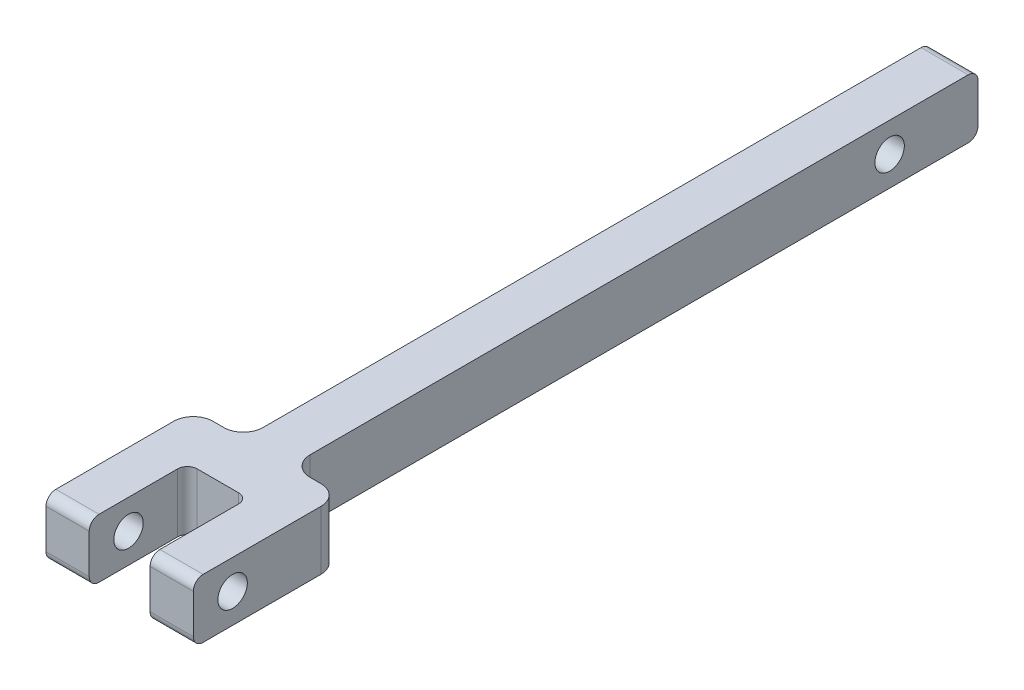
ISO-10303-21;
HEADER;
FILE_DESCRIPTION(('STEP AP214'),'2;1');
FILE_NAME('part.step','',(''),(''),'','','');
FILE_SCHEMA(('AUTOMOTIVE_DESIGN { 1 0 10303 214 1 1 1 1 }'));
ENDSEC;
DATA;
#1=APPLICATION_CONTEXT('core data for automotive mechanical design processes');
#2=APPLICATION_PROTOCOL_DEFINITION('international standard','automotive_design',2000,#1);
#3=PRODUCT_CONTEXT('',#1,'mechanical');
#4=PRODUCT('Part','Part','',(#3));
#5=PRODUCT_RELATED_PRODUCT_CATEGORY('part','',(#4));
#6=PRODUCT_DEFINITION_FORMATION('','',#4);
#7=PRODUCT_DEFINITION_CONTEXT('part definition',#1,'design');
#8=PRODUCT_DEFINITION('design','',#6,#7);
#9=PRODUCT_DEFINITION_SHAPE('','',#8);
#10=(LENGTH_UNIT() NAMED_UNIT(*) SI_UNIT(.MILLI.,.METRE.));
#11=(NAMED_UNIT(*) PLANE_ANGLE_UNIT() SI_UNIT($,.RADIAN.));
#12=(NAMED_UNIT(*) SI_UNIT($,.STERADIAN.) SOLID_ANGLE_UNIT());
#13=UNCERTAINTY_MEASURE_WITH_UNIT(LENGTH_MEASURE(1.E-05),#10,'distance_accuracy_value','');
#14=(GEOMETRIC_REPRESENTATION_CONTEXT(3) GLOBAL_UNCERTAINTY_ASSIGNED_CONTEXT((#13)) GLOBAL_UNIT_ASSIGNED_CONTEXT((#10,
#11,#12)) REPRESENTATION_CONTEXT('',''));
#15=CARTESIAN_POINT('',(0.,0.,0.));
#16=DIRECTION('',(0.,0.,1.));
#17=DIRECTION('',(1.,0.,0.));
#18=AXIS2_PLACEMENT_3D('',#15,#16,#17);
#19=CARTESIAN_POINT('',(2.4,-2.,41.5));
#20=DIRECTION('',(-1.,0.,0.));
#21=DIRECTION('',(0.,0.,1.));
#22=AXIS2_PLACEMENT_3D('',#19,#20,#21);
#23=CYLINDRICAL_SURFACE('',#22,1.);
#24=CARTESIAN_POINT('',(-3.1,-2.,41.5));
#25=DIRECTION('',(1.,0.,0.));
#26=DIRECTION('',(0.,0.,-1.));
#27=AXIS2_PLACEMENT_3D('',#24,#25,#26);
#28=CIRCLE('',#27,1.);
#29=CARTESIAN_POINT('',(-3.1,-2.,42.5));
#30=VERTEX_POINT('',#29);
#31=CARTESIAN_POINT('',(-3.1,-3.,41.5));
#32=VERTEX_POINT('',#31);
#33=EDGE_CURVE('E213',#30,#32,#28,.T.);
#34=ORIENTED_EDGE('',*,*,#33,.F.);
#35=DIRECTION('',(-1.,0.,0.));
#36=VECTOR('',#35,1.);
#37=CARTESIAN_POINT('',(2.4,-2.,42.5));
#38=LINE('',#37,#36);
#39=CARTESIAN_POINT('',(-7.5,-2.,42.5));
#40=VERTEX_POINT('',#39);
#41=EDGE_CURVE('E212',#30,#40,#38,.T.);
#42=ORIENTED_EDGE('',*,*,#41,.T.);
#43=CARTESIAN_POINT('',(-7.5,-2.,41.5));
#44=DIRECTION('',(1.,0.,0.));
#45=DIRECTION('',(0.,0.,-1.));
#46=AXIS2_PLACEMENT_3D('',#43,#44,#45);
#47=CIRCLE('',#46,1.);
#48=CARTESIAN_POINT('',(-7.5,-3.,41.5));
#49=VERTEX_POINT('',#48);
#50=EDGE_CURVE('E358',#40,#49,#47,.T.);
#51=ORIENTED_EDGE('',*,*,#50,.T.);
#52=DIRECTION('',(-1.,0.,0.));
#53=VECTOR('',#52,1.);
#54=CARTESIAN_POINT('',(2.4,-3.,41.5));
#55=LINE('',#54,#53);
#56=EDGE_CURVE('E243',#32,#49,#55,.T.);
#57=ORIENTED_EDGE('',*,*,#56,.F.);
#58=EDGE_LOOP('',(#34,#42,#51,#57));
#59=FACE_BOUND('',#58,.T.);
#60=ADVANCED_FACE('F32',(#59),#23,.T.);
#61=CARTESIAN_POINT('',(2.4,-3.,41.5));
#62=DIRECTION('',(0.,1.,0.));
#63=DIRECTION('',(0.,0.,1.));
#64=AXIS2_PLACEMENT_3D('',#61,#62,#63);
#65=PLANE('',#64);
#66=DIRECTION('',(-1.,0.,0.));
#67=VECTOR('',#66,1.);
#68=CARTESIAN_POINT('',(7.5,-3.,27.5));
#69=LINE('',#68,#67);
#70=CARTESIAN_POINT('',(5.5,-3.,27.5));
#71=VERTEX_POINT('',#70);
#72=CARTESIAN_POINT('',(4.4,-3.,27.5));
#73=VERTEX_POINT('',#72);
#74=EDGE_CURVE('E371',#71,#73,#69,.T.);
#75=ORIENTED_EDGE('',*,*,#74,.F.);
#76=CARTESIAN_POINT('',(5.5,-3.,29.5));
#77=DIRECTION('',(0.,1.,0.));
#78=DIRECTION('',(0.,0.,1.));
#79=AXIS2_PLACEMENT_3D('',#76,#77,#78);
#80=CIRCLE('',#79,2.);
#81=CARTESIAN_POINT('',(7.5,-3.,29.5));
#82=VERTEX_POINT('',#81);
#83=EDGE_CURVE('E268',#71,#82,#80,.F.);
#84=ORIENTED_EDGE('',*,*,#83,.T.);
#85=DIRECTION('',(0.,0.,-1.));
#86=VECTOR('',#85,1.);
#87=CARTESIAN_POINT('',(7.5,-3.,27.5));
#88=LINE('',#87,#86);
#89=CARTESIAN_POINT('',(7.5,-3.,41.5));
#90=VERTEX_POINT('',#89);
#91=EDGE_CURVE('E349',#90,#82,#88,.T.);
#92=ORIENTED_EDGE('',*,*,#91,.F.);
#93=CARTESIAN_POINT('',(3.1,-3.,41.5));
#94=VERTEX_POINT('',#93);
#95=EDGE_CURVE('E244',#90,#94,#55,.T.);
#96=ORIENTED_EDGE('',*,*,#95,.T.);
#97=DIRECTION('',(0.,0.,-1.));
#98=VECTOR('',#97,1.);
#99=CARTESIAN_POINT('',(3.1,-3.,32.5));
#100=LINE('',#99,#98);
#101=CARTESIAN_POINT('',(3.1,-3.,33.5));
#102=VERTEX_POINT('',#101);
#103=EDGE_CURVE('E329',#94,#102,#100,.T.);
#104=ORIENTED_EDGE('',*,*,#103,.T.);
#105=CARTESIAN_POINT('',(2.1,-3.,33.5));
#106=DIRECTION('',(0.,1.,0.));
#107=DIRECTION('',(0.,0.,1.));
#108=AXIS2_PLACEMENT_3D('',#105,#106,#107);
#109=CIRCLE('',#108,1.);
#110=CARTESIAN_POINT('',(2.1,-3.,32.5));
#111=VERTEX_POINT('',#110);
#112=EDGE_CURVE('E302',#102,#111,#109,.T.);
#113=ORIENTED_EDGE('',*,*,#112,.T.);
#114=DIRECTION('',(1.,0.,0.));
#115=VECTOR('',#114,1.);
#116=CARTESIAN_POINT('',(-3.1,-3.,32.5));
#117=LINE('',#116,#115);
#118=CARTESIAN_POINT('',(-2.1,-3.,32.5));
#119=VERTEX_POINT('',#118);
#120=EDGE_CURVE('E312',#119,#111,#117,.T.);
#121=ORIENTED_EDGE('',*,*,#120,.F.);
#122=CARTESIAN_POINT('',(-2.1,-3.,33.5));
#123=DIRECTION('',(0.,1.,0.));
#124=DIRECTION('',(0.,0.,1.));
#125=AXIS2_PLACEMENT_3D('',#122,#123,#124);
#126=CIRCLE('',#125,1.);
#127=CARTESIAN_POINT('',(-3.1,-3.,33.5));
#128=VERTEX_POINT('',#127);
#129=EDGE_CURVE('E11',#119,#128,#126,.T.);
#130=ORIENTED_EDGE('',*,*,#129,.T.);
#131=DIRECTION('',(0.,0.,-1.));
#132=VECTOR('',#131,1.);
#133=CARTESIAN_POINT('',(-3.1,-3.,32.5));
#134=LINE('',#133,#132);
#135=EDGE_CURVE('E314',#32,#128,#134,.T.);
#136=ORIENTED_EDGE('',*,*,#135,.F.);
#137=ORIENTED_EDGE('',*,*,#56,.T.);
#138=DIRECTION('',(0.,0.,-1.));
#139=VECTOR('',#138,1.);
#140=CARTESIAN_POINT('',(-7.5,-3.,27.5));
#141=LINE('',#140,#139);
#142=CARTESIAN_POINT('',(-7.5,-3.,29.5));
#143=VERTEX_POINT('',#142);
#144=EDGE_CURVE('E361',#49,#143,#141,.T.);
#145=ORIENTED_EDGE('',*,*,#144,.T.);
#146=CARTESIAN_POINT('',(-5.5,-3.,29.5));
#147=DIRECTION('',(0.,1.,0.));
#148=DIRECTION('',(0.,0.,1.));
#149=AXIS2_PLACEMENT_3D('',#146,#147,#148);
#150=CIRCLE('',#149,2.);
#151=CARTESIAN_POINT('',(-5.5,-3.,27.5));
#152=VERTEX_POINT('',#151);
#153=EDGE_CURVE('E266',#143,#152,#150,.F.);
#154=ORIENTED_EDGE('',*,*,#153,.T.);
#155=CARTESIAN_POINT('',(-4.4,-3.,27.5));
#156=VERTEX_POINT('',#155);
#157=EDGE_CURVE('E368',#156,#152,#69,.T.);
#158=ORIENTED_EDGE('',*,*,#157,.F.);
#159=CARTESIAN_POINT('',(-4.4,-3.,25.5));
#160=DIRECTION('',(0.,1.,0.));
#161=DIRECTION('',(0.,0.,1.));
#162=AXIS2_PLACEMENT_3D('',#159,#160,#161);
#163=CIRCLE('',#162,2.);
#164=CARTESIAN_POINT('',(-2.4,-3.,25.5));
#165=VERTEX_POINT('',#164);
#166=EDGE_CURVE('E287',#156,#165,#163,.T.);
#167=ORIENTED_EDGE('',*,*,#166,.T.);
#168=DIRECTION('',(0.,0.,-1.));
#169=VECTOR('',#168,1.);
#170=CARTESIAN_POINT('',(-2.4,-3.,41.5));
#171=LINE('',#170,#169);
#172=CARTESIAN_POINT('',(-2.4,-3.,-41.5));
#173=VERTEX_POINT('',#172);
#174=EDGE_CURVE('E378',#165,#173,#171,.T.);
#175=ORIENTED_EDGE('',*,*,#174,.T.);
#176=DIRECTION('',(-1.,0.,0.));
#177=VECTOR('',#176,1.);
#178=CARTESIAN_POINT('',(2.4,-3.,-41.5));
#179=LINE('',#178,#177);
#180=CARTESIAN_POINT('',(2.4,-3.,-41.5));
#181=VERTEX_POINT('',#180);
#182=EDGE_CURVE('E240',#181,#173,#179,.T.);
#183=ORIENTED_EDGE('',*,*,#182,.F.);
#184=DIRECTION('',(0.,0.,-1.));
#185=VECTOR('',#184,1.);
#186=CARTESIAN_POINT('',(2.4,-3.,41.5));
#187=LINE('',#186,#185);
#188=CARTESIAN_POINT('',(2.4,-3.,25.5));
#189=VERTEX_POINT('',#188);
#190=EDGE_CURVE('E379',#189,#181,#187,.T.);
#191=ORIENTED_EDGE('',*,*,#190,.F.);
#192=CARTESIAN_POINT('',(4.4,-3.,25.5));
#193=DIRECTION('',(0.,1.,0.));
#194=DIRECTION('',(0.,0.,1.));
#195=AXIS2_PLACEMENT_3D('',#192,#193,#194);
#196=CIRCLE('',#195,2.);
#197=EDGE_CURVE('E283',#189,#73,#196,.T.);
#198=ORIENTED_EDGE('',*,*,#197,.T.);
#199=EDGE_LOOP('',(#75,#84,#92,#96,#104,#113,#121,#130,#136,#137,#145,#154,#158,#167,#175,#183,
#191,#198));
#200=FACE_BOUND('',#199,.T.);
#201=ADVANCED_FACE('F414',(#200),#65,.F.);
#202=CARTESIAN_POINT('',(2.4,3.,41.5));
#203=DIRECTION('',(0.,-1.,0.));
#204=DIRECTION('',(0.,0.,-1.));
#205=AXIS2_PLACEMENT_3D('',#202,#203,#204);
#206=PLANE('',#205);
#207=DIRECTION('',(0.,0.,1.));
#208=VECTOR('',#207,1.);
#209=CARTESIAN_POINT('',(7.5,3.,41.5));
#210=LINE('',#209,#208);
#211=CARTESIAN_POINT('',(7.5,3.,29.5));
#212=VERTEX_POINT('',#211);
#213=CARTESIAN_POINT('',(7.5,3.,41.5));
#214=VERTEX_POINT('',#213);
#215=EDGE_CURVE('E352',#212,#214,#210,.T.);
#216=ORIENTED_EDGE('',*,*,#215,.F.);
#217=CARTESIAN_POINT('',(5.5,3.,29.5));
#218=DIRECTION('',(0.,-1.,0.));
#219=DIRECTION('',(0.,0.,-1.));
#220=AXIS2_PLACEMENT_3D('',#217,#218,#219);
#221=CIRCLE('',#220,2.);
#222=CARTESIAN_POINT('',(5.5,3.,27.5));
#223=VERTEX_POINT('',#222);
#224=EDGE_CURVE('E260',#212,#223,#221,.F.);
#225=ORIENTED_EDGE('',*,*,#224,.T.);
#226=DIRECTION('',(-1.,0.,0.));
#227=VECTOR('',#226,1.);
#228=CARTESIAN_POINT('',(7.5,3.,27.5));
#229=LINE('',#228,#227);
#230=CARTESIAN_POINT('',(4.4,3.,27.5));
#231=VERTEX_POINT('',#230);
#232=EDGE_CURVE('E367',#223,#231,#229,.T.);
#233=ORIENTED_EDGE('',*,*,#232,.T.);
#234=CARTESIAN_POINT('',(4.4,3.,25.5));
#235=DIRECTION('',(0.,-1.,0.));
#236=DIRECTION('',(0.,0.,-1.));
#237=AXIS2_PLACEMENT_3D('',#234,#235,#236);
#238=CIRCLE('',#237,2.);
#239=CARTESIAN_POINT('',(2.4,3.,25.5));
#240=VERTEX_POINT('',#239);
#241=EDGE_CURVE('E285',#231,#240,#238,.T.);
#242=ORIENTED_EDGE('',*,*,#241,.T.);
#243=DIRECTION('',(0.,0.,1.));
#244=VECTOR('',#243,1.);
#245=CARTESIAN_POINT('',(2.4,3.,41.5));
#246=LINE('',#245,#244);
#247=CARTESIAN_POINT('',(2.4,3.,-41.5));
#248=VERTEX_POINT('',#247);
#249=EDGE_CURVE('E388',#248,#240,#246,.T.);
#250=ORIENTED_EDGE('',*,*,#249,.F.);
#251=DIRECTION('',(-1.,0.,0.));
#252=VECTOR('',#251,1.);
#253=CARTESIAN_POINT('',(2.4,3.,-41.5));
#254=LINE('',#253,#252);
#255=CARTESIAN_POINT('',(-2.4,3.,-41.5));
#256=VERTEX_POINT('',#255);
#257=EDGE_CURVE('E231',#248,#256,#254,.T.);
#258=ORIENTED_EDGE('',*,*,#257,.T.);
#259=DIRECTION('',(0.,0.,1.));
#260=VECTOR('',#259,1.);
#261=CARTESIAN_POINT('',(-2.4,3.,41.5));
#262=LINE('',#261,#260);
#263=CARTESIAN_POINT('',(-2.4,3.,25.5));
#264=VERTEX_POINT('',#263);
#265=EDGE_CURVE('E382',#256,#264,#262,.T.);
#266=ORIENTED_EDGE('',*,*,#265,.T.);
#267=CARTESIAN_POINT('',(-4.4,3.,25.5));
#268=DIRECTION('',(0.,-1.,0.));
#269=DIRECTION('',(0.,0.,-1.));
#270=AXIS2_PLACEMENT_3D('',#267,#268,#269);
#271=CIRCLE('',#270,2.);
#272=CARTESIAN_POINT('',(-4.4,3.,27.5));
#273=VERTEX_POINT('',#272);
#274=EDGE_CURVE('E289',#264,#273,#271,.T.);
#275=ORIENTED_EDGE('',*,*,#274,.T.);
#276=CARTESIAN_POINT('',(-5.5,3.,27.5));
#277=VERTEX_POINT('',#276);
#278=EDGE_CURVE('E354',#273,#277,#229,.T.);
#279=ORIENTED_EDGE('',*,*,#278,.T.);
#280=CARTESIAN_POINT('',(-5.5,3.,29.5));
#281=DIRECTION('',(0.,-1.,0.));
#282=DIRECTION('',(0.,0.,-1.));
#283=AXIS2_PLACEMENT_3D('',#280,#281,#282);
#284=CIRCLE('',#283,2.);
#285=CARTESIAN_POINT('',(-7.5,3.,29.5));
#286=VERTEX_POINT('',#285);
#287=EDGE_CURVE('E258',#277,#286,#284,.F.);
#288=ORIENTED_EDGE('',*,*,#287,.T.);
#289=DIRECTION('',(0.,0.,1.));
#290=VECTOR('',#289,1.);
#291=CARTESIAN_POINT('',(-7.5,3.,41.5));
#292=LINE('',#291,#290);
#293=CARTESIAN_POINT('',(-7.5,3.,41.5));
#294=VERTEX_POINT('',#293);
#295=EDGE_CURVE('E343',#286,#294,#292,.T.);
#296=ORIENTED_EDGE('',*,*,#295,.T.);
#297=DIRECTION('',(-1.,0.,0.));
#298=VECTOR('',#297,1.);
#299=CARTESIAN_POINT('',(2.4,3.,41.5));
#300=LINE('',#299,#298);
#301=CARTESIAN_POINT('',(-3.1,3.,41.5));
#302=VERTEX_POINT('',#301);
#303=EDGE_CURVE('E223',#302,#294,#300,.T.);
#304=ORIENTED_EDGE('',*,*,#303,.F.);
#305=DIRECTION('',(0.,0.,1.));
#306=VECTOR('',#305,1.);
#307=CARTESIAN_POINT('',(-3.1,3.,41.5));
#308=LINE('',#307,#306);
#309=CARTESIAN_POINT('',(-3.1,3.,33.5));
#310=VERTEX_POINT('',#309);
#311=EDGE_CURVE('E199',#310,#302,#308,.T.);
#312=ORIENTED_EDGE('',*,*,#311,.F.);
#313=CARTESIAN_POINT('',(-2.1,3.,33.5));
#314=DIRECTION('',(0.,-1.,0.));
#315=DIRECTION('',(0.,0.,-1.));
#316=AXIS2_PLACEMENT_3D('',#313,#314,#315);
#317=CIRCLE('',#316,1.);
#318=CARTESIAN_POINT('',(-2.1,3.,32.5));
#319=VERTEX_POINT('',#318);
#320=EDGE_CURVE('E40',#310,#319,#317,.T.);
#321=ORIENTED_EDGE('',*,*,#320,.T.);
#322=DIRECTION('',(1.,0.,0.));
#323=VECTOR('',#322,1.);
#324=CARTESIAN_POINT('',(-3.1,3.,32.5));
#325=LINE('',#324,#323);
#326=CARTESIAN_POINT('',(2.1,3.,32.5));
#327=VERTEX_POINT('',#326);
#328=EDGE_CURVE('E252',#319,#327,#325,.T.);
#329=ORIENTED_EDGE('',*,*,#328,.T.);
#330=CARTESIAN_POINT('',(2.1,3.,33.5));
#331=DIRECTION('',(0.,-1.,0.));
#332=DIRECTION('',(0.,0.,-1.));
#333=AXIS2_PLACEMENT_3D('',#330,#331,#332);
#334=CIRCLE('',#333,1.);
#335=CARTESIAN_POINT('',(3.1,3.,33.5));
#336=VERTEX_POINT('',#335);
#337=EDGE_CURVE('E300',#327,#336,#334,.T.);
#338=ORIENTED_EDGE('',*,*,#337,.T.);
#339=DIRECTION('',(0.,0.,1.));
#340=VECTOR('',#339,1.);
#341=CARTESIAN_POINT('',(3.1,3.,41.5));
#342=LINE('',#341,#340);
#343=CARTESIAN_POINT('',(3.1,3.,41.5));
#344=VERTEX_POINT('',#343);
#345=EDGE_CURVE('E204',#336,#344,#342,.T.);
#346=ORIENTED_EDGE('',*,*,#345,.T.);
#347=EDGE_CURVE('E228',#214,#344,#300,.T.);
#348=ORIENTED_EDGE('',*,*,#347,.F.);
#349=EDGE_LOOP('',(#216,#225,#233,#242,#250,#258,#266,#275,#279,#288,#296,#304,#312,#321,#329,
#338,#346,#348));
#350=FACE_BOUND('',#349,.T.);
#351=ADVANCED_FACE('F307',(#350),#206,.F.);
#352=CARTESIAN_POINT('',(2.4,2.,41.5));
#353=DIRECTION('',(-1.,0.,0.));
#354=DIRECTION('',(0.,0.,1.));
#355=AXIS2_PLACEMENT_3D('',#352,#353,#354);
#356=CYLINDRICAL_SURFACE('',#355,1.);
#357=CARTESIAN_POINT('',(-3.1,2.,41.5));
#358=DIRECTION('',(1.,0.,0.));
#359=DIRECTION('',(0.,0.,-1.));
#360=AXIS2_PLACEMENT_3D('',#357,#358,#359);
#361=CIRCLE('',#360,1.);
#362=CARTESIAN_POINT('',(-3.1,2.,42.5));
#363=VERTEX_POINT('',#362);
#364=EDGE_CURVE('E192',#302,#363,#361,.T.);
#365=ORIENTED_EDGE('',*,*,#364,.F.);
#366=ORIENTED_EDGE('',*,*,#303,.T.);
#367=CARTESIAN_POINT('',(-7.5,2.,41.5));
#368=DIRECTION('',(1.,0.,0.));
#369=DIRECTION('',(0.,0.,-1.));
#370=AXIS2_PLACEMENT_3D('',#367,#368,#369);
#371=CIRCLE('',#370,1.);
#372=CARTESIAN_POINT('',(-7.5,2.,42.5));
#373=VERTEX_POINT('',#372);
#374=EDGE_CURVE('E218',#294,#373,#371,.T.);
#375=ORIENTED_EDGE('',*,*,#374,.T.);
#376=DIRECTION('',(-1.,0.,0.));
#377=VECTOR('',#376,1.);
#378=CARTESIAN_POINT('',(2.4,2.,42.5));
#379=LINE('',#378,#377);
#380=EDGE_CURVE('E210',#363,#373,#379,.T.);
#381=ORIENTED_EDGE('',*,*,#380,.F.);
#382=EDGE_LOOP('',(#365,#366,#375,#381));
#383=FACE_BOUND('',#382,.T.);
#384=ADVANCED_FACE('F216',(#383),#356,.T.);
#385=CARTESIAN_POINT('',(2.4,2.,42.5));
#386=DIRECTION('',(0.,0.,-1.));
#387=DIRECTION('',(-1.,0.,0.));
#388=AXIS2_PLACEMENT_3D('',#385,#386,#387);
#389=PLANE('',#388);
#390=DIRECTION('',(0.,-1.,0.));
#391=VECTOR('',#390,1.);
#392=CARTESIAN_POINT('',(-3.1,2.,42.5));
#393=LINE('',#392,#391);
#394=EDGE_CURVE('E196',#363,#30,#393,.T.);
#395=ORIENTED_EDGE('',*,*,#394,.F.);
#396=ORIENTED_EDGE('',*,*,#380,.T.);
#397=DIRECTION('',(0.,-1.,0.));
#398=VECTOR('',#397,1.);
#399=CARTESIAN_POINT('',(-7.5,2.,42.5));
#400=LINE('',#399,#398);
#401=EDGE_CURVE('E356',#373,#40,#400,.T.);
#402=ORIENTED_EDGE('',*,*,#401,.T.);
#403=ORIENTED_EDGE('',*,*,#41,.F.);
#404=EDGE_LOOP('',(#395,#396,#402,#403));
#405=FACE_BOUND('',#404,.T.);
#406=ADVANCED_FACE('F208',(#405),#389,.F.);
#407=CARTESIAN_POINT('',(-2.4,0.,38.5));
#408=DIRECTION('',(1.,0.,0.));
#409=DIRECTION('',(0.,0.,-1.));
#410=AXIS2_PLACEMENT_3D('',#407,#408,#409);
#411=CYLINDRICAL_SURFACE('',#410,1.5);
#412=CARTESIAN_POINT('',(-7.5,0.,38.5));
#413=DIRECTION('',(1.,0.,0.));
#414=DIRECTION('',(0.,0.,-1.));
#415=AXIS2_PLACEMENT_3D('',#412,#413,#414);
#416=CIRCLE('',#415,1.5);
#417=CARTESIAN_POINT('',(-7.5,0.,37.));
#418=VERTEX_POINT('',#417);
#419=EDGE_CURVE('E255',#418,#418,#416,.T.);
#420=ORIENTED_EDGE('',*,*,#419,.F.);
#421=EDGE_LOOP('',(#420));
#422=FACE_BOUND('',#421,.T.);
#423=CARTESIAN_POINT('',(-3.1,0.,38.5));
#424=DIRECTION('',(1.,0.,0.));
#425=DIRECTION('',(0.,0.,-1.));
#426=AXIS2_PLACEMENT_3D('',#423,#424,#425);
#427=CIRCLE('',#426,1.5);
#428=CARTESIAN_POINT('',(-3.1,0.,37.));
#429=VERTEX_POINT('',#428);
#430=EDGE_CURVE('E251',#429,#429,#427,.F.);
#431=ORIENTED_EDGE('',*,*,#430,.F.);
#432=EDGE_LOOP('',(#431));
#433=FACE_BOUND('',#432,.T.);
#434=ADVANCED_FACE('F514',(#422,#433),#411,.F.);
#435=CARTESIAN_POINT('',(2.4,-2.,41.5));
#436=DIRECTION('',(1.,0.,0.));
#437=DIRECTION('',(0.,0.,-1.));
#438=AXIS2_PLACEMENT_3D('',#435,#436,#437);
#439=PLANE('',#438);
#440=CARTESIAN_POINT('',(2.4,0.,-33.5));
#441=DIRECTION('',(1.,0.,0.));
#442=DIRECTION('',(0.,0.,-1.));
#443=AXIS2_PLACEMENT_3D('',#440,#441,#442);
#444=CIRCLE('',#443,1.5);
#445=CARTESIAN_POINT('',(2.4,0.,-35.));
#446=VERTEX_POINT('',#445);
#447=EDGE_CURVE('E372',#446,#446,#444,.T.);
#448=ORIENTED_EDGE('',*,*,#447,.F.);
#449=EDGE_LOOP('',(#448));
#450=FACE_BOUND('',#449,.T.);
#451=ORIENTED_EDGE('',*,*,#249,.T.);
#452=DIRECTION('',(0.,-1.,0.));
#453=VECTOR('',#452,1.);
#454=CARTESIAN_POINT('',(2.4,-2.,25.5));
#455=LINE('',#454,#453);
#456=EDGE_CURVE('E278',#240,#189,#455,.T.);
#457=ORIENTED_EDGE('',*,*,#456,.T.);
#458=ORIENTED_EDGE('',*,*,#190,.T.);
#459=CARTESIAN_POINT('',(2.4,-2.,-41.5));
#460=DIRECTION('',(1.,0.,0.));
#461=DIRECTION('',(0.,0.,-1.));
#462=AXIS2_PLACEMENT_3D('',#459,#460,#461);
#463=CIRCLE('',#462,1.);
#464=CARTESIAN_POINT('',(2.4,-2.,-42.5));
#465=VERTEX_POINT('',#464);
#466=EDGE_CURVE('E381',#181,#465,#463,.T.);
#467=ORIENTED_EDGE('',*,*,#466,.T.);
#468=DIRECTION('',(0.,1.,0.));
#469=VECTOR('',#468,1.);
#470=CARTESIAN_POINT('',(2.4,2.,-42.5));
#471=LINE('',#470,#469);
#472=CARTESIAN_POINT('',(2.4,2.,-42.5));
#473=VERTEX_POINT('',#472);
#474=EDGE_CURVE('E384',#465,#473,#471,.T.);
#475=ORIENTED_EDGE('',*,*,#474,.T.);
#476=CARTESIAN_POINT('',(2.4,2.,-41.5));
#477=DIRECTION('',(1.,0.,0.));
#478=DIRECTION('',(0.,0.,1.));
#479=AXIS2_PLACEMENT_3D('',#476,#477,#478);
#480=CIRCLE('',#479,1.);
#481=EDGE_CURVE('E386',#473,#248,#480,.T.);
#482=ORIENTED_EDGE('',*,*,#481,.T.);
#483=EDGE_LOOP('',(#451,#457,#458,#467,#475,#482));
#484=FACE_BOUND('',#483,.T.);
#485=ADVANCED_FACE('F446',(#450,#484),#439,.T.);
#486=CARTESIAN_POINT('',(-2.4,-2.,41.5));
#487=DIRECTION('',(1.,0.,0.));
#488=DIRECTION('',(0.,0.,-1.));
#489=AXIS2_PLACEMENT_3D('',#486,#487,#488);
#490=PLANE('',#489);
#491=CARTESIAN_POINT('',(-2.4,0.,-33.5));
#492=DIRECTION('',(1.,0.,0.));
#493=DIRECTION('',(0.,0.,-1.));
#494=AXIS2_PLACEMENT_3D('',#491,#492,#493);
#495=CIRCLE('',#494,1.5);
#496=CARTESIAN_POINT('',(-2.4,0.,-35.));
#497=VERTEX_POINT('',#496);
#498=EDGE_CURVE('E375',#497,#497,#495,.T.);
#499=ORIENTED_EDGE('',*,*,#498,.T.);
#500=EDGE_LOOP('',(#499));
#501=FACE_BOUND('',#500,.T.);
#502=ORIENTED_EDGE('',*,*,#174,.F.);
#503=DIRECTION('',(0.,-1.,0.));
#504=VECTOR('',#503,1.);
#505=CARTESIAN_POINT('',(-2.4,3.,25.5));
#506=LINE('',#505,#504);
#507=EDGE_CURVE('E281',#165,#264,#506,.F.);
#508=ORIENTED_EDGE('',*,*,#507,.T.);
#509=ORIENTED_EDGE('',*,*,#265,.F.);
#510=CARTESIAN_POINT('',(-2.4,2.,-41.5));
#511=DIRECTION('',(1.,0.,0.));
#512=DIRECTION('',(0.,0.,1.));
#513=AXIS2_PLACEMENT_3D('',#510,#511,#512);
#514=CIRCLE('',#513,1.);
#515=CARTESIAN_POINT('',(-2.4,2.,-42.5));
#516=VERTEX_POINT('',#515);
#517=EDGE_CURVE('E396',#516,#256,#514,.T.);
#518=ORIENTED_EDGE('',*,*,#517,.F.);
#519=DIRECTION('',(0.,1.,0.));
#520=VECTOR('',#519,1.);
#521=CARTESIAN_POINT('',(-2.4,2.,-42.5));
#522=LINE('',#521,#520);
#523=CARTESIAN_POINT('',(-2.4,-2.,-42.5));
#524=VERTEX_POINT('',#523);
#525=EDGE_CURVE('E394',#524,#516,#522,.T.);
#526=ORIENTED_EDGE('',*,*,#525,.F.);
#527=CARTESIAN_POINT('',(-2.4,-2.,-41.5));
#528=DIRECTION('',(1.,0.,0.));
#529=DIRECTION('',(0.,0.,-1.));
#530=AXIS2_PLACEMENT_3D('',#527,#528,#529);
#531=CIRCLE('',#530,1.);
#532=EDGE_CURVE('E392',#173,#524,#531,.T.);
#533=ORIENTED_EDGE('',*,*,#532,.F.);
#534=EDGE_LOOP('',(#502,#508,#509,#518,#526,#533));
#535=FACE_BOUND('',#534,.T.);
#536=ADVANCED_FACE('F437',(#501,#535),#490,.F.);
#537=CARTESIAN_POINT('',(7.5,-2.,42.5));
#538=VERTEX_POINT('',#537);
#539=CARTESIAN_POINT('',(3.1,-2.,42.5));
#540=VERTEX_POINT('',#539);
#541=EDGE_CURVE('E220',#538,#540,#38,.T.);
#542=ORIENTED_EDGE('',*,*,#541,.T.);
#543=CARTESIAN_POINT('',(3.1,-2.,41.5));
#544=DIRECTION('',(1.,0.,0.));
#545=DIRECTION('',(0.,0.,-1.));
#546=AXIS2_PLACEMENT_3D('',#543,#544,#545);
#547=CIRCLE('',#546,1.);
#548=EDGE_CURVE('E326',#540,#94,#547,.T.);
#549=ORIENTED_EDGE('',*,*,#548,.T.);
#550=ORIENTED_EDGE('',*,*,#95,.F.);
#551=CARTESIAN_POINT('',(7.5,-2.,41.5));
#552=DIRECTION('',(1.,0.,0.));
#553=DIRECTION('',(0.,0.,-1.));
#554=AXIS2_PLACEMENT_3D('',#551,#552,#553);
#555=CIRCLE('',#554,1.);
#556=EDGE_CURVE('E346',#538,#90,#555,.T.);
#557=ORIENTED_EDGE('',*,*,#556,.F.);
#558=EDGE_LOOP('',(#542,#549,#550,#557));
#559=FACE_BOUND('',#558,.T.);
#560=ADVANCED_FACE('F429',(#559),#23,.T.);
#561=CARTESIAN_POINT('',(2.4,-2.,-41.5));
#562=DIRECTION('',(-1.,0.,0.));
#563=DIRECTION('',(0.,0.,1.));
#564=AXIS2_PLACEMENT_3D('',#561,#562,#563);
#565=CYLINDRICAL_SURFACE('',#564,1.);
#566=ORIENTED_EDGE('',*,*,#532,.T.);
#567=DIRECTION('',(-1.,0.,0.));
#568=VECTOR('',#567,1.);
#569=CARTESIAN_POINT('',(2.4,-2.,-42.5));
#570=LINE('',#569,#568);
#571=EDGE_CURVE('E237',#465,#524,#570,.T.);
#572=ORIENTED_EDGE('',*,*,#571,.F.);
#573=ORIENTED_EDGE('',*,*,#466,.F.);
#574=ORIENTED_EDGE('',*,*,#182,.T.);
#575=EDGE_LOOP('',(#566,#572,#573,#574));
#576=FACE_BOUND('',#575,.T.);
#577=ADVANCED_FACE('F436',(#576),#565,.T.);
#578=CARTESIAN_POINT('',(2.4,2.,-42.5));
#579=DIRECTION('',(0.,0.,1.));
#580=DIRECTION('',(1.,0.,0.));
#581=AXIS2_PLACEMENT_3D('',#578,#579,#580);
#582=PLANE('',#581);
#583=ORIENTED_EDGE('',*,*,#525,.T.);
#584=DIRECTION('',(-1.,0.,0.));
#585=VECTOR('',#584,1.);
#586=CARTESIAN_POINT('',(2.4,2.,-42.5));
#587=LINE('',#586,#585);
#588=EDGE_CURVE('E234',#473,#516,#587,.T.);
#589=ORIENTED_EDGE('',*,*,#588,.F.);
#590=ORIENTED_EDGE('',*,*,#474,.F.);
#591=ORIENTED_EDGE('',*,*,#571,.T.);
#592=EDGE_LOOP('',(#583,#589,#590,#591));
#593=FACE_BOUND('',#592,.T.);
#594=ADVANCED_FACE('F443',(#593),#582,.F.);
#595=CARTESIAN_POINT('',(2.4,2.,-41.5));
#596=DIRECTION('',(-1.,0.,0.));
#597=DIRECTION('',(0.,0.,1.));
#598=AXIS2_PLACEMENT_3D('',#595,#596,#597);
#599=CYLINDRICAL_SURFACE('',#598,1.);
#600=ORIENTED_EDGE('',*,*,#517,.T.);
#601=ORIENTED_EDGE('',*,*,#257,.F.);
#602=ORIENTED_EDGE('',*,*,#481,.F.);
#603=ORIENTED_EDGE('',*,*,#588,.T.);
#604=EDGE_LOOP('',(#600,#601,#602,#603));
#605=FACE_BOUND('',#604,.T.);
#606=ADVANCED_FACE('F491',(#605),#599,.T.);
#607=ORIENTED_EDGE('',*,*,#347,.T.);
#608=CARTESIAN_POINT('',(3.1,2.,41.5));
#609=DIRECTION('',(1.,0.,0.));
#610=DIRECTION('',(0.,0.,-1.));
#611=AXIS2_PLACEMENT_3D('',#608,#609,#610);
#612=CIRCLE('',#611,1.);
#613=CARTESIAN_POINT('',(3.1,2.,42.5));
#614=VERTEX_POINT('',#613);
#615=EDGE_CURVE('E320',#344,#614,#612,.T.);
#616=ORIENTED_EDGE('',*,*,#615,.T.);
#617=CARTESIAN_POINT('',(7.5,2.,42.5));
#618=VERTEX_POINT('',#617);
#619=EDGE_CURVE('E219',#618,#614,#379,.T.);
#620=ORIENTED_EDGE('',*,*,#619,.F.);
#621=CARTESIAN_POINT('',(7.5,2.,41.5));
#622=DIRECTION('',(1.,0.,0.));
#623=DIRECTION('',(0.,0.,-1.));
#624=AXIS2_PLACEMENT_3D('',#621,#622,#623);
#625=CIRCLE('',#624,1.);
#626=EDGE_CURVE('E339',#214,#618,#625,.T.);
#627=ORIENTED_EDGE('',*,*,#626,.F.);
#628=EDGE_LOOP('',(#607,#616,#620,#627));
#629=FACE_BOUND('',#628,.T.);
#630=ADVANCED_FACE('F460',(#629),#356,.T.);
#631=ORIENTED_EDGE('',*,*,#619,.T.);
#632=DIRECTION('',(0.,-1.,0.));
#633=VECTOR('',#632,1.);
#634=CARTESIAN_POINT('',(3.1,2.,42.5));
#635=LINE('',#634,#633);
#636=EDGE_CURVE('E323',#614,#540,#635,.T.);
#637=ORIENTED_EDGE('',*,*,#636,.T.);
#638=ORIENTED_EDGE('',*,*,#541,.F.);
#639=DIRECTION('',(0.,-1.,0.));
#640=VECTOR('',#639,1.);
#641=CARTESIAN_POINT('',(7.5,2.,42.5));
#642=LINE('',#641,#640);
#643=EDGE_CURVE('E342',#618,#538,#642,.T.);
#644=ORIENTED_EDGE('',*,*,#643,.F.);
#645=EDGE_LOOP('',(#631,#637,#638,#644));
#646=FACE_BOUND('',#645,.T.);
#647=ADVANCED_FACE('F452',(#646),#389,.F.);
#648=CARTESIAN_POINT('',(-2.4,0.,-33.5));
#649=DIRECTION('',(1.,0.,0.));
#650=DIRECTION('',(0.,0.,-1.));
#651=AXIS2_PLACEMENT_3D('',#648,#649,#650);
#652=CYLINDRICAL_SURFACE('',#651,1.5);
#653=ORIENTED_EDGE('',*,*,#498,.F.);
#654=EDGE_LOOP('',(#653));
#655=FACE_BOUND('',#654,.T.);
#656=ORIENTED_EDGE('',*,*,#447,.T.);
#657=EDGE_LOOP('',(#656));
#658=FACE_BOUND('',#657,.T.);
#659=ADVANCED_FACE('F510',(#655,#658),#652,.F.);
#660=CARTESIAN_POINT('',(7.5,3.,27.5));
#661=DIRECTION('',(0.,0.,1.));
#662=DIRECTION('',(1.,0.,0.));
#663=AXIS2_PLACEMENT_3D('',#660,#661,#662);
#664=PLANE('',#663);
#665=ORIENTED_EDGE('',*,*,#157,.T.);
#666=DIRECTION('',(0.,1.,0.));
#667=VECTOR('',#666,1.);
#668=CARTESIAN_POINT('',(-5.5,3.,27.5));
#669=LINE('',#668,#667);
#670=EDGE_CURVE('E273',#152,#277,#669,.T.);
#671=ORIENTED_EDGE('',*,*,#670,.T.);
#672=ORIENTED_EDGE('',*,*,#278,.F.);
#673=DIRECTION('',(0.,-1.,0.));
#674=VECTOR('',#673,1.);
#675=CARTESIAN_POINT('',(-4.4,-3.,27.5));
#676=LINE('',#675,#674);
#677=EDGE_CURVE('E270',#273,#156,#676,.T.);
#678=ORIENTED_EDGE('',*,*,#677,.T.);
#679=EDGE_LOOP('',(#665,#671,#672,#678));
#680=FACE_BOUND('',#679,.T.);
#681=ADVANCED_FACE('F411',(#680),#664,.F.);
#682=CARTESIAN_POINT('',(-7.5,2.,41.5));
#683=DIRECTION('',(1.,0.,0.));
#684=DIRECTION('',(0.,0.,-1.));
#685=AXIS2_PLACEMENT_3D('',#682,#683,#684);
#686=PLANE('',#685);
#687=ORIENTED_EDGE('',*,*,#295,.F.);
#688=DIRECTION('',(0.,1.,0.));
#689=VECTOR('',#688,1.);
#690=CARTESIAN_POINT('',(-7.5,2.,29.5));
#691=LINE('',#690,#689);
#692=EDGE_CURVE('E276',#286,#143,#691,.F.);
#693=ORIENTED_EDGE('',*,*,#692,.T.);
#694=ORIENTED_EDGE('',*,*,#144,.F.);
#695=ORIENTED_EDGE('',*,*,#50,.F.);
#696=ORIENTED_EDGE('',*,*,#401,.F.);
#697=ORIENTED_EDGE('',*,*,#374,.F.);
#698=EDGE_LOOP('',(#687,#693,#694,#695,#696,#697));
#699=FACE_BOUND('',#698,.T.);
#700=ORIENTED_EDGE('',*,*,#419,.T.);
#701=EDGE_LOOP('',(#700));
#702=FACE_BOUND('',#701,.T.);
#703=ADVANCED_FACE('F423',(#699,#702),#686,.F.);
#704=CARTESIAN_POINT('',(3.1,0.,38.5));
#705=DIRECTION('',(1.,0.,0.));
#706=DIRECTION('',(0.,0.,-1.));
#707=AXIS2_PLACEMENT_3D('',#704,#705,#706);
#708=CIRCLE('',#707,1.5);
#709=CARTESIAN_POINT('',(3.1,0.,37.));
#710=VERTEX_POINT('',#709);
#711=EDGE_CURVE('E248',#710,#710,#708,.F.);
#712=ORIENTED_EDGE('',*,*,#711,.T.);
#713=EDGE_LOOP('',(#712));
#714=FACE_BOUND('',#713,.T.);
#715=CARTESIAN_POINT('',(7.5,0.,38.5));
#716=DIRECTION('',(1.,0.,0.));
#717=DIRECTION('',(0.,0.,-1.));
#718=AXIS2_PLACEMENT_3D('',#715,#716,#717);
#719=CIRCLE('',#718,1.5);
#720=CARTESIAN_POINT('',(7.5,0.,37.));
#721=VERTEX_POINT('',#720);
#722=EDGE_CURVE('E334',#721,#721,#719,.T.);
#723=ORIENTED_EDGE('',*,*,#722,.T.);
#724=EDGE_LOOP('',(#723));
#725=FACE_BOUND('',#724,.T.);
#726=ADVANCED_FACE('F519',(#714,#725),#411,.F.);
#727=CARTESIAN_POINT('',(7.5,2.,41.5));
#728=DIRECTION('',(1.,0.,0.));
#729=DIRECTION('',(0.,0.,-1.));
#730=AXIS2_PLACEMENT_3D('',#727,#728,#729);
#731=PLANE('',#730);
#732=ORIENTED_EDGE('',*,*,#91,.T.);
#733=DIRECTION('',(0.,1.,0.));
#734=VECTOR('',#733,1.);
#735=CARTESIAN_POINT('',(7.5,3.,29.5));
#736=LINE('',#735,#734);
#737=EDGE_CURVE('E247',#82,#212,#736,.T.);
#738=ORIENTED_EDGE('',*,*,#737,.T.);
#739=ORIENTED_EDGE('',*,*,#215,.T.);
#740=ORIENTED_EDGE('',*,*,#626,.T.);
#741=ORIENTED_EDGE('',*,*,#643,.T.);
#742=ORIENTED_EDGE('',*,*,#556,.T.);
#743=EDGE_LOOP('',(#732,#738,#739,#740,#741,#742));
#744=FACE_BOUND('',#743,.T.);
#745=ORIENTED_EDGE('',*,*,#722,.F.);
#746=EDGE_LOOP('',(#745));
#747=FACE_BOUND('',#746,.T.);
#748=ADVANCED_FACE('F454',(#744,#747),#731,.T.);
#749=ORIENTED_EDGE('',*,*,#232,.F.);
#750=DIRECTION('',(0.,1.,0.));
#751=VECTOR('',#750,1.);
#752=CARTESIAN_POINT('',(5.5,-3.,27.5));
#753=LINE('',#752,#751);
#754=EDGE_CURVE('E264',#223,#71,#753,.F.);
#755=ORIENTED_EDGE('',*,*,#754,.T.);
#756=ORIENTED_EDGE('',*,*,#74,.T.);
#757=DIRECTION('',(0.,-1.,0.));
#758=VECTOR('',#757,1.);
#759=CARTESIAN_POINT('',(4.4,3.,27.5));
#760=LINE('',#759,#758);
#761=EDGE_CURVE('E262',#73,#231,#760,.F.);
#762=ORIENTED_EDGE('',*,*,#761,.T.);
#763=EDGE_LOOP('',(#749,#755,#756,#762));
#764=FACE_BOUND('',#763,.T.);
#765=ADVANCED_FACE('F477',(#764),#664,.F.);
#766=CARTESIAN_POINT('',(-3.1,2.,41.5));
#767=DIRECTION('',(1.,0.,0.));
#768=DIRECTION('',(0.,0.,-1.));
#769=AXIS2_PLACEMENT_3D('',#766,#767,#768);
#770=PLANE('',#769);
#771=ORIENTED_EDGE('',*,*,#135,.T.);
#772=DIRECTION('',(0.,1.,0.));
#773=VECTOR('',#772,1.);
#774=CARTESIAN_POINT('',(-3.1,2.,33.5));
#775=LINE('',#774,#773);
#776=EDGE_CURVE('E298',#128,#310,#775,.T.);
#777=ORIENTED_EDGE('',*,*,#776,.T.);
#778=ORIENTED_EDGE('',*,*,#311,.T.);
#779=ORIENTED_EDGE('',*,*,#364,.T.);
#780=ORIENTED_EDGE('',*,*,#394,.T.);
#781=ORIENTED_EDGE('',*,*,#33,.T.);
#782=EDGE_LOOP('',(#771,#777,#778,#779,#780,#781));
#783=FACE_BOUND('',#782,.T.);
#784=ORIENTED_EDGE('',*,*,#430,.T.);
#785=EDGE_LOOP('',(#784));
#786=FACE_BOUND('',#785,.T.);
#787=ADVANCED_FACE('F194',(#783,#786),#770,.T.);
#788=CARTESIAN_POINT('',(3.1,2.,41.5));
#789=DIRECTION('',(1.,0.,0.));
#790=DIRECTION('',(0.,0.,-1.));
#791=AXIS2_PLACEMENT_3D('',#788,#789,#790);
#792=PLANE('',#791);
#793=ORIENTED_EDGE('',*,*,#345,.F.);
#794=DIRECTION('',(0.,1.,0.));
#795=VECTOR('',#794,1.);
#796=CARTESIAN_POINT('',(3.1,-3.,33.5));
#797=LINE('',#796,#795);
#798=EDGE_CURVE('E296',#336,#102,#797,.F.);
#799=ORIENTED_EDGE('',*,*,#798,.T.);
#800=ORIENTED_EDGE('',*,*,#103,.F.);
#801=ORIENTED_EDGE('',*,*,#548,.F.);
#802=ORIENTED_EDGE('',*,*,#636,.F.);
#803=ORIENTED_EDGE('',*,*,#615,.F.);
#804=EDGE_LOOP('',(#793,#799,#800,#801,#802,#803));
#805=FACE_BOUND('',#804,.T.);
#806=ORIENTED_EDGE('',*,*,#711,.F.);
#807=EDGE_LOOP('',(#806));
#808=FACE_BOUND('',#807,.T.);
#809=ADVANCED_FACE('F464',(#805,#808),#792,.F.);
#810=CARTESIAN_POINT('',(-3.1,3.,32.5));
#811=DIRECTION('',(0.,0.,-1.));
#812=DIRECTION('',(-1.,0.,0.));
#813=AXIS2_PLACEMENT_3D('',#810,#811,#812);
#814=PLANE('',#813);
#815=ORIENTED_EDGE('',*,*,#120,.T.);
#816=DIRECTION('',(0.,1.,0.));
#817=VECTOR('',#816,1.);
#818=CARTESIAN_POINT('',(2.1,3.,32.5));
#819=LINE('',#818,#817);
#820=EDGE_CURVE('E293',#111,#327,#819,.T.);
#821=ORIENTED_EDGE('',*,*,#820,.T.);
#822=ORIENTED_EDGE('',*,*,#328,.F.);
#823=DIRECTION('',(0.,1.,0.));
#824=VECTOR('',#823,1.);
#825=CARTESIAN_POINT('',(-2.1,3.,32.5));
#826=LINE('',#825,#824);
#827=EDGE_CURVE('E291',#319,#119,#826,.F.);
#828=ORIENTED_EDGE('',*,*,#827,.T.);
#829=EDGE_LOOP('',(#815,#821,#822,#828));
#830=FACE_BOUND('',#829,.T.);
#831=ADVANCED_FACE('F310',(#830),#814,.F.);
#832=CARTESIAN_POINT('',(5.5,2.,29.5));
#833=DIRECTION('',(0.,-1.,0.));
#834=DIRECTION('',(0.,0.,-1.));
#835=AXIS2_PLACEMENT_3D('',#832,#833,#834);
#836=CYLINDRICAL_SURFACE('',#835,2.);
#837=ORIENTED_EDGE('',*,*,#83,.F.);
#838=ORIENTED_EDGE('',*,*,#754,.F.);
#839=ORIENTED_EDGE('',*,*,#224,.F.);
#840=ORIENTED_EDGE('',*,*,#737,.F.);
#841=EDGE_LOOP('',(#837,#838,#839,#840));
#842=FACE_BOUND('',#841,.T.);
#843=ADVANCED_FACE('F481',(#842),#836,.T.);
#844=CARTESIAN_POINT('',(-5.5,3.,29.5));
#845=DIRECTION('',(0.,1.,0.));
#846=DIRECTION('',(0.,0.,1.));
#847=AXIS2_PLACEMENT_3D('',#844,#845,#846);
#848=CYLINDRICAL_SURFACE('',#847,2.);
#849=ORIENTED_EDGE('',*,*,#153,.F.);
#850=ORIENTED_EDGE('',*,*,#692,.F.);
#851=ORIENTED_EDGE('',*,*,#287,.F.);
#852=ORIENTED_EDGE('',*,*,#670,.F.);
#853=EDGE_LOOP('',(#849,#850,#851,#852));
#854=FACE_BOUND('',#853,.T.);
#855=ADVANCED_FACE('F420',(#854),#848,.T.);
#856=CARTESIAN_POINT('',(4.4,-2.,25.5));
#857=DIRECTION('',(0.,-1.,0.));
#858=DIRECTION('',(0.,0.,-1.));
#859=AXIS2_PLACEMENT_3D('',#856,#857,#858);
#860=CYLINDRICAL_SURFACE('',#859,2.);
#861=ORIENTED_EDGE('',*,*,#241,.F.);
#862=ORIENTED_EDGE('',*,*,#761,.F.);
#863=ORIENTED_EDGE('',*,*,#197,.F.);
#864=ORIENTED_EDGE('',*,*,#456,.F.);
#865=EDGE_LOOP('',(#861,#862,#863,#864));
#866=FACE_BOUND('',#865,.T.);
#867=ADVANCED_FACE('F484',(#866),#860,.F.);
#868=CARTESIAN_POINT('',(-4.4,3.,25.5));
#869=DIRECTION('',(0.,1.,0.));
#870=DIRECTION('',(0.,0.,1.));
#871=AXIS2_PLACEMENT_3D('',#868,#869,#870);
#872=CYLINDRICAL_SURFACE('',#871,2.);
#873=ORIENTED_EDGE('',*,*,#274,.F.);
#874=ORIENTED_EDGE('',*,*,#507,.F.);
#875=ORIENTED_EDGE('',*,*,#166,.F.);
#876=ORIENTED_EDGE('',*,*,#677,.F.);
#877=EDGE_LOOP('',(#873,#874,#875,#876));
#878=FACE_BOUND('',#877,.T.);
#879=ADVANCED_FACE('F408',(#878),#872,.F.);
#880=CARTESIAN_POINT('',(2.1,3.,33.5));
#881=DIRECTION('',(0.,-1.,0.));
#882=DIRECTION('',(0.,0.,-1.));
#883=AXIS2_PLACEMENT_3D('',#880,#881,#882);
#884=CYLINDRICAL_SURFACE('',#883,1.);
#885=ORIENTED_EDGE('',*,*,#112,.F.);
#886=ORIENTED_EDGE('',*,*,#798,.F.);
#887=ORIENTED_EDGE('',*,*,#337,.F.);
#888=ORIENTED_EDGE('',*,*,#820,.F.);
#889=EDGE_LOOP('',(#885,#886,#887,#888));
#890=FACE_BOUND('',#889,.T.);
#891=ADVANCED_FACE('F469',(#890),#884,.F.);
#892=CARTESIAN_POINT('',(-2.1,2.,33.5));
#893=DIRECTION('',(0.,1.,0.));
#894=DIRECTION('',(0.,0.,1.));
#895=AXIS2_PLACEMENT_3D('',#892,#893,#894);
#896=CYLINDRICAL_SURFACE('',#895,1.);
#897=ORIENTED_EDGE('',*,*,#129,.F.);
#898=ORIENTED_EDGE('',*,*,#827,.F.);
#899=ORIENTED_EDGE('',*,*,#320,.F.);
#900=ORIENTED_EDGE('',*,*,#776,.F.);
#901=EDGE_LOOP('',(#897,#898,#899,#900));
#902=FACE_BOUND('',#901,.T.);
#903=ADVANCED_FACE('F34',(#902),#896,.F.);
#904=CLOSED_SHELL('',(#60,#201,#351,#384,#406,#434,#485,#536,#560,#577,#594,#606,#630,#647,#659,
#681,#703,#726,#748,#765,#787,#809,#831,#843,#855,#867,#879,#891,#903));
#905=MANIFOLD_SOLID_BREP('B2',#904);
#906=ADVANCED_BREP_SHAPE_REPRESENTATION('',(#18,#905),#14);
#907=SHAPE_DEFINITION_REPRESENTATION(#9,#906);
ENDSEC;
END-ISO-10303-21;
